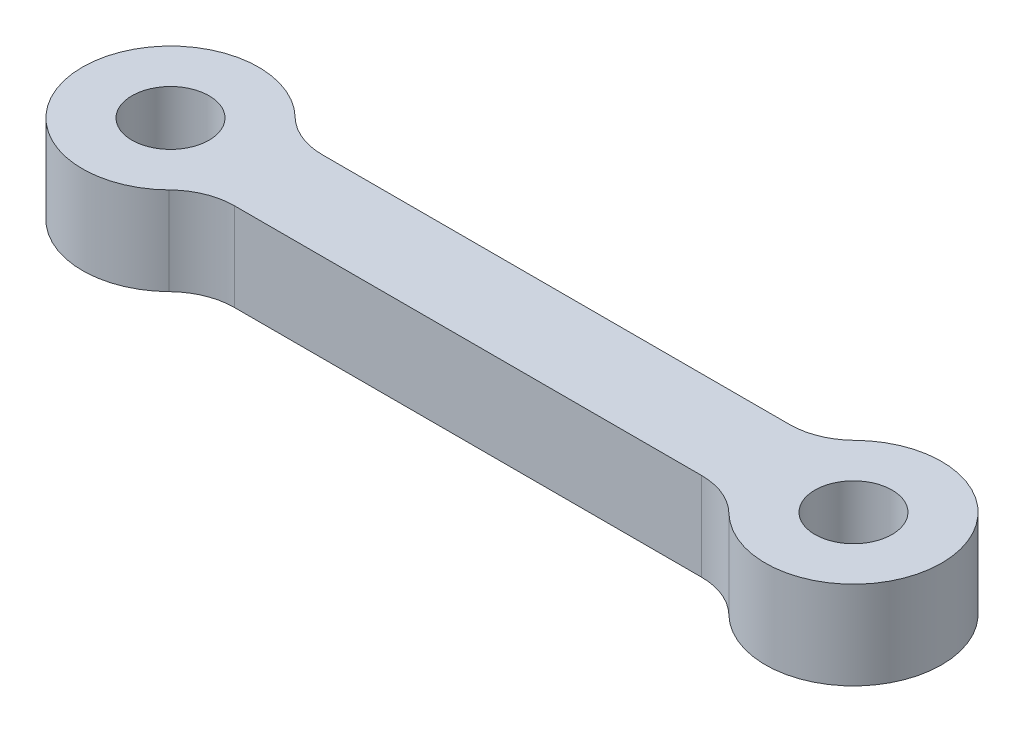
ISO-10303-21;
HEADER;
FILE_DESCRIPTION(('STEP AP214'),'2;1');
FILE_NAME('part.step','',(''),(''),'','','');
FILE_SCHEMA(('AUTOMOTIVE_DESIGN { 1 0 10303 214 1 1 1 1 }'));
ENDSEC;
DATA;
#1=APPLICATION_CONTEXT('core data for automotive mechanical design processes');
#2=APPLICATION_PROTOCOL_DEFINITION('international standard','automotive_design',2000,#1);
#3=PRODUCT_CONTEXT('',#1,'mechanical');
#4=PRODUCT('Part','Part','',(#3));
#5=PRODUCT_RELATED_PRODUCT_CATEGORY('part','',(#4));
#6=PRODUCT_DEFINITION_FORMATION('','',#4);
#7=PRODUCT_DEFINITION_CONTEXT('part definition',#1,'design');
#8=PRODUCT_DEFINITION('design','',#6,#7);
#9=PRODUCT_DEFINITION_SHAPE('','',#8);
#10=(LENGTH_UNIT() NAMED_UNIT(*) SI_UNIT(.MILLI.,.METRE.));
#11=(NAMED_UNIT(*) PLANE_ANGLE_UNIT() SI_UNIT($,.RADIAN.));
#12=(NAMED_UNIT(*) SI_UNIT($,.STERADIAN.) SOLID_ANGLE_UNIT());
#13=UNCERTAINTY_MEASURE_WITH_UNIT(LENGTH_MEASURE(1.E-05),#10,'distance_accuracy_value','');
#14=(GEOMETRIC_REPRESENTATION_CONTEXT(3) GLOBAL_UNCERTAINTY_ASSIGNED_CONTEXT((#13)) GLOBAL_UNIT_ASSIGNED_CONTEXT((#10,
#11,#12)) REPRESENTATION_CONTEXT('',''));
#15=CARTESIAN_POINT('',(0.,0.,0.));
#16=DIRECTION('',(0.,0.,1.));
#17=DIRECTION('',(1.,0.,0.));
#18=AXIS2_PLACEMENT_3D('',#15,#16,#17);
#19=CARTESIAN_POINT('',(31.,4.,0.));
#20=DIRECTION('',(0.,-1.,0.));
#21=DIRECTION('',(0.,0.,-1.));
#22=AXIS2_PLACEMENT_3D('',#19,#20,#21);
#23=CYLINDRICAL_SURFACE('',#22,4.);
#24=CARTESIAN_POINT('',(31.,4.,0.));
#25=DIRECTION('',(0.,1.,0.));
#26=DIRECTION('',(0.,0.,1.));
#27=AXIS2_PLACEMENT_3D('',#24,#25,#26);
#28=CIRCLE('',#27,4.);
#29=CARTESIAN_POINT('',(28.2005831511049,4.,2.85714285714286));
#30=VERTEX_POINT('',#29);
#31=CARTESIAN_POINT('',(28.2005831511049,4.,-2.85714285714286));
#32=VERTEX_POINT('',#31);
#33=EDGE_CURVE('E119',#30,#32,#28,.T.);
#34=ORIENTED_EDGE('',*,*,#33,.F.);
#35=DIRECTION('',(0.,-1.,0.));
#36=VECTOR('',#35,1.);
#37=CARTESIAN_POINT('',(28.2005831511049,4.,2.85714285714286));
#38=LINE('',#37,#36);
#39=CARTESIAN_POINT('',(28.2005831511049,0.,2.85714285714286));
#40=VERTEX_POINT('',#39);
#41=EDGE_CURVE('E106',#30,#40,#38,.T.);
#42=ORIENTED_EDGE('',*,*,#41,.T.);
#43=CARTESIAN_POINT('',(31.,0.,0.));
#44=DIRECTION('',(0.,1.,0.));
#45=DIRECTION('',(0.,0.,1.));
#46=AXIS2_PLACEMENT_3D('',#43,#44,#45);
#47=CIRCLE('',#46,4.);
#48=CARTESIAN_POINT('',(28.2005831511049,0.,-2.85714285714286));
#49=VERTEX_POINT('',#48);
#50=EDGE_CURVE('E117',#40,#49,#47,.T.);
#51=ORIENTED_EDGE('',*,*,#50,.T.);
#52=DIRECTION('',(0.,-1.,0.));
#53=VECTOR('',#52,1.);
#54=CARTESIAN_POINT('',(28.2005831511049,4.,-2.85714285714286));
#55=LINE('',#54,#53);
#56=EDGE_CURVE('E121',#49,#32,#55,.F.);
#57=ORIENTED_EDGE('',*,*,#56,.T.);
#58=EDGE_LOOP('',(#34,#42,#51,#57));
#59=FACE_BOUND('',#58,.T.);
#60=ADVANCED_FACE('F36',(#59),#23,.T.);
#61=CARTESIAN_POINT('',(0.,4.,-2.));
#62=DIRECTION('',(0.,0.,-1.));
#63=DIRECTION('',(-1.,0.,0.));
#64=AXIS2_PLACEMENT_3D('',#61,#62,#63);
#65=PLANE('',#64);
#66=DIRECTION('',(1.,0.,0.));
#67=VECTOR('',#66,1.);
#68=CARTESIAN_POINT('',(0.,0.,-2.));
#69=LINE('',#68,#67);
#70=CARTESIAN_POINT('',(4.89897948556636,0.,-2.));
#71=VERTEX_POINT('',#70);
#72=CARTESIAN_POINT('',(26.1010205144336,0.,-2.));
#73=VERTEX_POINT('',#72);
#74=EDGE_CURVE('E127',#71,#73,#69,.T.);
#75=ORIENTED_EDGE('',*,*,#74,.F.);
#76=DIRECTION('',(0.,-1.,0.));
#77=VECTOR('',#76,1.);
#78=CARTESIAN_POINT('',(4.89897948556636,4.,-2.));
#79=LINE('',#78,#77);
#80=CARTESIAN_POINT('',(4.89897948556636,4.,-2.));
#81=VERTEX_POINT('',#80);
#82=EDGE_CURVE('E58',#71,#81,#79,.F.);
#83=ORIENTED_EDGE('',*,*,#82,.T.);
#84=DIRECTION('',(1.,0.,0.));
#85=VECTOR('',#84,1.);
#86=CARTESIAN_POINT('',(0.,4.,-2.));
#87=LINE('',#86,#85);
#88=CARTESIAN_POINT('',(26.1010205144336,4.,-2.));
#89=VERTEX_POINT('',#88);
#90=EDGE_CURVE('E185',#81,#89,#87,.T.);
#91=ORIENTED_EDGE('',*,*,#90,.T.);
#92=DIRECTION('',(0.,-1.,0.));
#93=VECTOR('',#92,1.);
#94=CARTESIAN_POINT('',(26.1010205144336,4.,-2.));
#95=LINE('',#94,#93);
#96=EDGE_CURVE('E154',#89,#73,#95,.T.);
#97=ORIENTED_EDGE('',*,*,#96,.T.);
#98=EDGE_LOOP('',(#75,#83,#91,#97));
#99=FACE_BOUND('',#98,.T.);
#100=ADVANCED_FACE('F192',(#99),#65,.T.);
#101=CARTESIAN_POINT('',(0.,4.,0.));
#102=DIRECTION('',(0.,-1.,0.));
#103=DIRECTION('',(0.,0.,-1.));
#104=AXIS2_PLACEMENT_3D('',#101,#102,#103);
#105=CYLINDRICAL_SURFACE('',#104,4.);
#106=CARTESIAN_POINT('',(0.,4.,0.));
#107=DIRECTION('',(0.,1.,0.));
#108=DIRECTION('',(0.,0.,1.));
#109=AXIS2_PLACEMENT_3D('',#106,#107,#108);
#110=CIRCLE('',#109,4.);
#111=CARTESIAN_POINT('',(2.79941684889506,4.,-2.85714285714286));
#112=VERTEX_POINT('',#111);
#113=CARTESIAN_POINT('',(2.79941684889506,4.,2.85714285714286));
#114=VERTEX_POINT('',#113);
#115=EDGE_CURVE('E179',#112,#114,#110,.T.);
#116=ORIENTED_EDGE('',*,*,#115,.F.);
#117=DIRECTION('',(0.,-1.,0.));
#118=VECTOR('',#117,1.);
#119=CARTESIAN_POINT('',(2.79941684889506,4.,-2.85714285714286));
#120=LINE('',#119,#118);
#121=CARTESIAN_POINT('',(2.79941684889506,0.,-2.85714285714286));
#122=VERTEX_POINT('',#121);
#123=EDGE_CURVE('E151',#112,#122,#120,.T.);
#124=ORIENTED_EDGE('',*,*,#123,.T.);
#125=CARTESIAN_POINT('',(0.,0.,0.));
#126=DIRECTION('',(0.,1.,0.));
#127=DIRECTION('',(0.,0.,1.));
#128=AXIS2_PLACEMENT_3D('',#125,#126,#127);
#129=CIRCLE('',#128,4.);
#130=CARTESIAN_POINT('',(2.79941684889506,0.,2.85714285714286));
#131=VERTEX_POINT('',#130);
#132=EDGE_CURVE('E129',#122,#131,#129,.T.);
#133=ORIENTED_EDGE('',*,*,#132,.T.);
#134=DIRECTION('',(0.,-1.,0.));
#135=VECTOR('',#134,1.);
#136=CARTESIAN_POINT('',(2.79941684889506,4.,2.85714285714286));
#137=LINE('',#136,#135);
#138=EDGE_CURVE('E149',#131,#114,#137,.F.);
#139=ORIENTED_EDGE('',*,*,#138,.T.);
#140=EDGE_LOOP('',(#116,#124,#133,#139));
#141=FACE_BOUND('',#140,.T.);
#142=ADVANCED_FACE('F170',(#141),#105,.T.);
#143=CARTESIAN_POINT('',(0.,4.,0.));
#144=DIRECTION('',(0.,-1.,0.));
#145=DIRECTION('',(0.,0.,-1.));
#146=AXIS2_PLACEMENT_3D('',#143,#144,#145);
#147=CYLINDRICAL_SURFACE('',#146,1.75);
#148=CARTESIAN_POINT('',(0.,4.,0.));
#149=DIRECTION('',(0.,1.,0.));
#150=DIRECTION('',(0.,0.,1.));
#151=AXIS2_PLACEMENT_3D('',#148,#149,#150);
#152=CIRCLE('',#151,1.75);
#153=CARTESIAN_POINT('',(0.,4.,1.75));
#154=VERTEX_POINT('',#153);
#155=EDGE_CURVE('E182',#154,#154,#152,.T.);
#156=ORIENTED_EDGE('',*,*,#155,.T.);
#157=EDGE_LOOP('',(#156));
#158=FACE_BOUND('',#157,.T.);
#159=CARTESIAN_POINT('',(0.,0.,0.));
#160=DIRECTION('',(0.,1.,0.));
#161=DIRECTION('',(0.,0.,1.));
#162=AXIS2_PLACEMENT_3D('',#159,#160,#161);
#163=CIRCLE('',#162,1.75);
#164=CARTESIAN_POINT('',(0.,0.,1.75));
#165=VERTEX_POINT('',#164);
#166=EDGE_CURVE('E139',#165,#165,#163,.T.);
#167=ORIENTED_EDGE('',*,*,#166,.F.);
#168=EDGE_LOOP('',(#167));
#169=FACE_BOUND('',#168,.T.);
#170=ADVANCED_FACE('F212',(#158,#169),#147,.F.);
#171=CARTESIAN_POINT('',(0.,4.,2.));
#172=DIRECTION('',(0.,0.,-1.));
#173=DIRECTION('',(-1.,0.,0.));
#174=AXIS2_PLACEMENT_3D('',#171,#172,#173);
#175=PLANE('',#174);
#176=DIRECTION('',(1.,0.,0.));
#177=VECTOR('',#176,1.);
#178=CARTESIAN_POINT('',(0.,0.,2.));
#179=LINE('',#178,#177);
#180=CARTESIAN_POINT('',(4.89897948556636,0.,2.));
#181=VERTEX_POINT('',#180);
#182=CARTESIAN_POINT('',(26.1010205144336,0.,2.));
#183=VERTEX_POINT('',#182);
#184=EDGE_CURVE('E137',#181,#183,#179,.T.);
#185=ORIENTED_EDGE('',*,*,#184,.T.);
#186=DIRECTION('',(0.,1.,0.));
#187=VECTOR('',#186,1.);
#188=CARTESIAN_POINT('',(26.1010205144336,4.,2.));
#189=LINE('',#188,#187);
#190=CARTESIAN_POINT('',(26.1010205144336,4.,2.));
#191=VERTEX_POINT('',#190);
#192=EDGE_CURVE('E107',#183,#191,#189,.T.);
#193=ORIENTED_EDGE('',*,*,#192,.T.);
#194=DIRECTION('',(1.,0.,0.));
#195=VECTOR('',#194,1.);
#196=CARTESIAN_POINT('',(0.,4.,2.));
#197=LINE('',#196,#195);
#198=CARTESIAN_POINT('',(4.89897948556636,4.,2.));
#199=VERTEX_POINT('',#198);
#200=EDGE_CURVE('E178',#199,#191,#197,.T.);
#201=ORIENTED_EDGE('',*,*,#200,.F.);
#202=DIRECTION('',(0.,1.,0.));
#203=VECTOR('',#202,1.);
#204=CARTESIAN_POINT('',(4.89897948556636,0.,2.));
#205=LINE('',#204,#203);
#206=EDGE_CURVE('E120',#199,#181,#205,.F.);
#207=ORIENTED_EDGE('',*,*,#206,.T.);
#208=EDGE_LOOP('',(#185,#193,#201,#207));
#209=FACE_BOUND('',#208,.T.);
#210=ADVANCED_FACE('F181',(#209),#175,.F.);
#211=CARTESIAN_POINT('',(31.,4.,0.));
#212=DIRECTION('',(0.,-1.,0.));
#213=DIRECTION('',(0.,0.,-1.));
#214=AXIS2_PLACEMENT_3D('',#211,#212,#213);
#215=CYLINDRICAL_SURFACE('',#214,1.75);
#216=CARTESIAN_POINT('',(31.,4.,0.));
#217=DIRECTION('',(0.,1.,0.));
#218=DIRECTION('',(0.,0.,1.));
#219=AXIS2_PLACEMENT_3D('',#216,#217,#218);
#220=CIRCLE('',#219,1.75);
#221=CARTESIAN_POINT('',(31.,4.,1.75));
#222=VERTEX_POINT('',#221);
#223=EDGE_CURVE('E132',#222,#222,#220,.T.);
#224=ORIENTED_EDGE('',*,*,#223,.T.);
#225=EDGE_LOOP('',(#224));
#226=FACE_BOUND('',#225,.T.);
#227=CARTESIAN_POINT('',(31.,0.,0.));
#228=DIRECTION('',(0.,1.,0.));
#229=DIRECTION('',(0.,0.,1.));
#230=AXIS2_PLACEMENT_3D('',#227,#228,#229);
#231=CIRCLE('',#230,1.75);
#232=CARTESIAN_POINT('',(31.,0.,1.75));
#233=VERTEX_POINT('',#232);
#234=EDGE_CURVE('E142',#233,#233,#231,.T.);
#235=ORIENTED_EDGE('',*,*,#234,.F.);
#236=EDGE_LOOP('',(#235));
#237=FACE_BOUND('',#236,.T.);
#238=ADVANCED_FACE('F215',(#226,#237),#215,.F.);
#239=CARTESIAN_POINT('',(0.,4.,0.));
#240=DIRECTION('',(0.,1.,0.));
#241=DIRECTION('',(0.,0.,1.));
#242=AXIS2_PLACEMENT_3D('',#239,#240,#241);
#243=PLANE('',#242);
#244=ORIENTED_EDGE('',*,*,#200,.T.);
#245=CARTESIAN_POINT('',(26.1010205144336,4.,5.));
#246=DIRECTION('',(0.,1.,0.));
#247=DIRECTION('',(0.,0.,1.));
#248=AXIS2_PLACEMENT_3D('',#245,#246,#247);
#249=CIRCLE('',#248,3.);
#250=EDGE_CURVE('E112',#191,#30,#249,.F.);
#251=ORIENTED_EDGE('',*,*,#250,.T.);
#252=ORIENTED_EDGE('',*,*,#33,.T.);
#253=CARTESIAN_POINT('',(26.1010205144336,4.,-5.));
#254=DIRECTION('',(0.,1.,0.));
#255=DIRECTION('',(0.,0.,1.));
#256=AXIS2_PLACEMENT_3D('',#253,#254,#255);
#257=CIRCLE('',#256,3.);
#258=EDGE_CURVE('E51',#32,#89,#257,.F.);
#259=ORIENTED_EDGE('',*,*,#258,.T.);
#260=ORIENTED_EDGE('',*,*,#90,.F.);
#261=CARTESIAN_POINT('',(4.89897948556636,4.,-5.));
#262=DIRECTION('',(0.,1.,0.));
#263=DIRECTION('',(0.,0.,1.));
#264=AXIS2_PLACEMENT_3D('',#261,#262,#263);
#265=CIRCLE('',#264,3.);
#266=EDGE_CURVE('E161',#81,#112,#265,.F.);
#267=ORIENTED_EDGE('',*,*,#266,.T.);
#268=ORIENTED_EDGE('',*,*,#115,.T.);
#269=CARTESIAN_POINT('',(4.89897948556636,4.,5.));
#270=DIRECTION('',(0.,1.,0.));
#271=DIRECTION('',(0.,0.,1.));
#272=AXIS2_PLACEMENT_3D('',#269,#270,#271);
#273=CIRCLE('',#272,3.);
#274=EDGE_CURVE('E11',#114,#199,#273,.F.);
#275=ORIENTED_EDGE('',*,*,#274,.T.);
#276=EDGE_LOOP('',(#244,#251,#252,#259,#260,#267,#268,#275));
#277=FACE_BOUND('',#276,.T.);
#278=ORIENTED_EDGE('',*,*,#155,.F.);
#279=EDGE_LOOP('',(#278));
#280=FACE_BOUND('',#279,.T.);
#281=ORIENTED_EDGE('',*,*,#223,.F.);
#282=EDGE_LOOP('',(#281));
#283=FACE_BOUND('',#282,.T.);
#284=ADVANCED_FACE('F176',(#277,#280,#283),#243,.T.);
#285=CARTESIAN_POINT('',(0.,0.,0.));
#286=DIRECTION('',(0.,1.,0.));
#287=DIRECTION('',(0.,0.,1.));
#288=AXIS2_PLACEMENT_3D('',#285,#286,#287);
#289=PLANE('',#288);
#290=ORIENTED_EDGE('',*,*,#50,.F.);
#291=CARTESIAN_POINT('',(26.1010205144336,0.,5.));
#292=DIRECTION('',(0.,1.,0.));
#293=DIRECTION('',(0.,0.,1.));
#294=AXIS2_PLACEMENT_3D('',#291,#292,#293);
#295=CIRCLE('',#294,3.);
#296=EDGE_CURVE('E102',#40,#183,#295,.T.);
#297=ORIENTED_EDGE('',*,*,#296,.T.);
#298=ORIENTED_EDGE('',*,*,#184,.F.);
#299=CARTESIAN_POINT('',(4.89897948556636,0.,5.));
#300=DIRECTION('',(0.,1.,0.));
#301=DIRECTION('',(0.,0.,1.));
#302=AXIS2_PLACEMENT_3D('',#299,#300,#301);
#303=CIRCLE('',#302,3.);
#304=EDGE_CURVE('E44',#181,#131,#303,.T.);
#305=ORIENTED_EDGE('',*,*,#304,.T.);
#306=ORIENTED_EDGE('',*,*,#132,.F.);
#307=CARTESIAN_POINT('',(4.89897948556636,0.,-5.));
#308=DIRECTION('',(0.,1.,0.));
#309=DIRECTION('',(0.,0.,1.));
#310=AXIS2_PLACEMENT_3D('',#307,#308,#309);
#311=CIRCLE('',#310,3.);
#312=EDGE_CURVE('E159',#122,#71,#311,.T.);
#313=ORIENTED_EDGE('',*,*,#312,.T.);
#314=ORIENTED_EDGE('',*,*,#74,.T.);
#315=CARTESIAN_POINT('',(26.1010205144336,0.,-5.));
#316=DIRECTION('',(0.,1.,0.));
#317=DIRECTION('',(0.,0.,1.));
#318=AXIS2_PLACEMENT_3D('',#315,#316,#317);
#319=CIRCLE('',#318,3.);
#320=EDGE_CURVE('E126',#73,#49,#319,.T.);
#321=ORIENTED_EDGE('',*,*,#320,.T.);
#322=EDGE_LOOP('',(#290,#297,#298,#305,#306,#313,#314,#321));
#323=FACE_BOUND('',#322,.T.);
#324=ORIENTED_EDGE('',*,*,#166,.T.);
#325=EDGE_LOOP('',(#324));
#326=FACE_BOUND('',#325,.T.);
#327=ORIENTED_EDGE('',*,*,#234,.T.);
#328=EDGE_LOOP('',(#327));
#329=FACE_BOUND('',#328,.T.);
#330=ADVANCED_FACE('F123',(#323,#326,#329),#289,.F.);
#331=CARTESIAN_POINT('',(26.1010205144336,4.,5.));
#332=DIRECTION('',(0.,-1.,0.));
#333=DIRECTION('',(0.,0.,-1.));
#334=AXIS2_PLACEMENT_3D('',#331,#332,#333);
#335=CYLINDRICAL_SURFACE('',#334,3.);
#336=ORIENTED_EDGE('',*,*,#250,.F.);
#337=ORIENTED_EDGE('',*,*,#192,.F.);
#338=ORIENTED_EDGE('',*,*,#296,.F.);
#339=ORIENTED_EDGE('',*,*,#41,.F.);
#340=EDGE_LOOP('',(#336,#337,#338,#339));
#341=FACE_BOUND('',#340,.T.);
#342=ADVANCED_FACE('F105',(#341),#335,.F.);
#343=CARTESIAN_POINT('',(4.89897948556636,4.,-5.));
#344=DIRECTION('',(0.,-1.,0.));
#345=DIRECTION('',(0.,0.,-1.));
#346=AXIS2_PLACEMENT_3D('',#343,#344,#345);
#347=CYLINDRICAL_SURFACE('',#346,3.);
#348=ORIENTED_EDGE('',*,*,#266,.F.);
#349=ORIENTED_EDGE('',*,*,#82,.F.);
#350=ORIENTED_EDGE('',*,*,#312,.F.);
#351=ORIENTED_EDGE('',*,*,#123,.F.);
#352=EDGE_LOOP('',(#348,#349,#350,#351));
#353=FACE_BOUND('',#352,.T.);
#354=ADVANCED_FACE('F195',(#353),#347,.F.);
#355=CARTESIAN_POINT('',(26.1010205144336,4.,-5.));
#356=DIRECTION('',(0.,-1.,0.));
#357=DIRECTION('',(0.,0.,-1.));
#358=AXIS2_PLACEMENT_3D('',#355,#356,#357);
#359=CYLINDRICAL_SURFACE('',#358,3.);
#360=ORIENTED_EDGE('',*,*,#258,.F.);
#361=ORIENTED_EDGE('',*,*,#56,.F.);
#362=ORIENTED_EDGE('',*,*,#320,.F.);
#363=ORIENTED_EDGE('',*,*,#96,.F.);
#364=EDGE_LOOP('',(#360,#361,#362,#363));
#365=FACE_BOUND('',#364,.T.);
#366=ADVANCED_FACE('F191',(#365),#359,.F.);
#367=CARTESIAN_POINT('',(4.89897948556636,4.,5.));
#368=DIRECTION('',(0.,-1.,0.));
#369=DIRECTION('',(0.,0.,-1.));
#370=AXIS2_PLACEMENT_3D('',#367,#368,#369);
#371=CYLINDRICAL_SURFACE('',#370,3.);
#372=ORIENTED_EDGE('',*,*,#274,.F.);
#373=ORIENTED_EDGE('',*,*,#138,.F.);
#374=ORIENTED_EDGE('',*,*,#304,.F.);
#375=ORIENTED_EDGE('',*,*,#206,.F.);
#376=EDGE_LOOP('',(#372,#373,#374,#375));
#377=FACE_BOUND('',#376,.T.);
#378=ADVANCED_FACE('F38',(#377),#371,.F.);
#379=CLOSED_SHELL('',(#60,#100,#142,#170,#210,#238,#284,#330,#342,#354,#366,#378));
#380=MANIFOLD_SOLID_BREP('B2',#379);
#381=ADVANCED_BREP_SHAPE_REPRESENTATION('',(#18,#380),#14);
#382=SHAPE_DEFINITION_REPRESENTATION(#9,#381);
ENDSEC;
END-ISO-10303-21;
